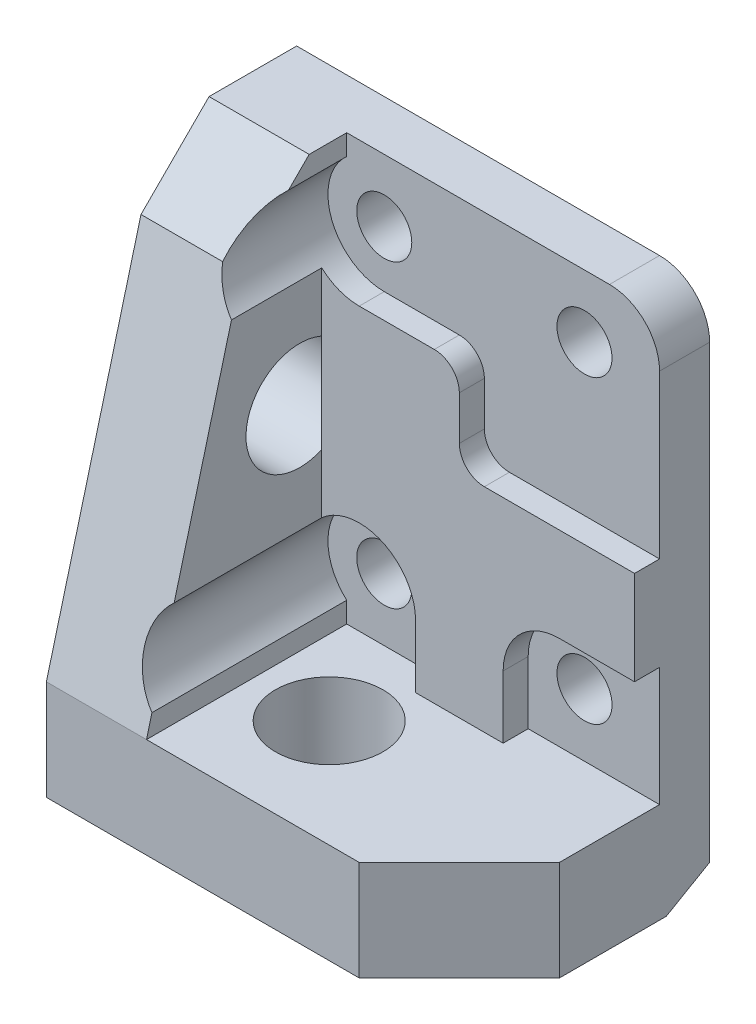
ISO-10303-21;
HEADER;
FILE_DESCRIPTION(('STEP AP214'),'2;1');
FILE_NAME('part.step','',(''),(''),'','','');
FILE_SCHEMA(('AUTOMOTIVE_DESIGN { 1 0 10303 214 1 1 1 1 }'));
ENDSEC;
DATA;
#1=APPLICATION_CONTEXT('core data for automotive mechanical design processes');
#2=APPLICATION_PROTOCOL_DEFINITION('international standard','automotive_design',2000,#1);
#3=PRODUCT_CONTEXT('',#1,'mechanical');
#4=PRODUCT('Part','Part','',(#3));
#5=PRODUCT_RELATED_PRODUCT_CATEGORY('part','',(#4));
#6=PRODUCT_DEFINITION_FORMATION('','',#4);
#7=PRODUCT_DEFINITION_CONTEXT('part definition',#1,'design');
#8=PRODUCT_DEFINITION('design','',#6,#7);
#9=PRODUCT_DEFINITION_SHAPE('','',#8);
#10=(LENGTH_UNIT() NAMED_UNIT(*) SI_UNIT(.MILLI.,.METRE.));
#11=(NAMED_UNIT(*) PLANE_ANGLE_UNIT() SI_UNIT($,.RADIAN.));
#12=(NAMED_UNIT(*) SI_UNIT($,.STERADIAN.) SOLID_ANGLE_UNIT());
#13=UNCERTAINTY_MEASURE_WITH_UNIT(LENGTH_MEASURE(1.E-05),#10,'distance_accuracy_value','');
#14=(GEOMETRIC_REPRESENTATION_CONTEXT(3) GLOBAL_UNCERTAINTY_ASSIGNED_CONTEXT((#13)) GLOBAL_UNIT_ASSIGNED_CONTEXT((#10,
#11,#12)) REPRESENTATION_CONTEXT('',''));
#15=CARTESIAN_POINT('',(0.,0.,0.));
#16=DIRECTION('',(0.,0.,1.));
#17=DIRECTION('',(1.,0.,0.));
#18=AXIS2_PLACEMENT_3D('',#15,#16,#17);
#19=CARTESIAN_POINT('',(-7.5,14.5,3.));
#20=DIRECTION('',(0.,-1.,0.));
#21=DIRECTION('',(1.,0.,0.));
#22=AXIS2_PLACEMENT_3D('',#19,#20,#21);
#23=PLANE('',#22);
#24=DIRECTION('',(0.,0.,-1.));
#25=VECTOR('',#24,1.);
#26=CARTESIAN_POINT('',(-5.5,14.5,5.5));
#27=LINE('',#26,#25);
#28=CARTESIAN_POINT('',(-5.5,14.5,3.49999999999999));
#29=VERTEX_POINT('',#28);
#30=CARTESIAN_POINT('',(-5.5,14.5,0.));
#31=VERTEX_POINT('',#30);
#32=EDGE_CURVE('E392',#29,#31,#27,.T.);
#33=ORIENTED_EDGE('',*,*,#32,.F.);
#34=DIRECTION('',(1.,0.,0.));
#35=VECTOR('',#34,1.);
#36=CARTESIAN_POINT('',(-1.5,14.5,3.49999999999999));
#37=LINE('',#36,#35);
#38=CARTESIAN_POINT('',(-1.5,14.5,3.49999999999999));
#39=VERTEX_POINT('',#38);
#40=EDGE_CURVE('E62',#29,#39,#37,.T.);
#41=ORIENTED_EDGE('',*,*,#40,.T.);
#42=DIRECTION('',(0.,0.,-1.));
#43=VECTOR('',#42,1.);
#44=CARTESIAN_POINT('',(-1.5,14.5,0.));
#45=LINE('',#44,#43);
#46=CARTESIAN_POINT('',(-1.5,14.5,2.));
#47=VERTEX_POINT('',#46);
#48=EDGE_CURVE('E292',#39,#47,#45,.T.);
#49=ORIENTED_EDGE('',*,*,#48,.T.);
#50=DIRECTION('',(1.,0.,0.));
#51=VECTOR('',#50,1.);
#52=CARTESIAN_POINT('',(5.75,14.5,2.));
#53=LINE('',#52,#51);
#54=CARTESIAN_POINT('',(9.,14.5,2.));
#55=VERTEX_POINT('',#54);
#56=EDGE_CURVE('E461',#47,#55,#53,.T.);
#57=ORIENTED_EDGE('',*,*,#56,.T.);
#58=DIRECTION('',(0.,0.,1.));
#59=VECTOR('',#58,1.);
#60=CARTESIAN_POINT('',(9.,14.5,3.));
#61=LINE('',#60,#59);
#62=CARTESIAN_POINT('',(9.,14.5,0.));
#63=VERTEX_POINT('',#62);
#64=EDGE_CURVE('E362',#55,#63,#61,.F.);
#65=ORIENTED_EDGE('',*,*,#64,.T.);
#66=DIRECTION('',(-1.,0.,0.));
#67=VECTOR('',#66,1.);
#68=CARTESIAN_POINT('',(-7.5,14.5,0.));
#69=LINE('',#68,#67);
#70=EDGE_CURVE('E313',#63,#31,#69,.T.);
#71=ORIENTED_EDGE('',*,*,#70,.T.);
#72=EDGE_LOOP('',(#33,#41,#49,#57,#65,#71));
#73=FACE_BOUND('',#72,.T.);
#74=ADVANCED_FACE('F39',(#73),#23,.F.);
#75=CARTESIAN_POINT('',(0.,0.,3.));
#76=DIRECTION('',(0.,0.,1.));
#77=DIRECTION('',(1.,0.,0.));
#78=AXIS2_PLACEMENT_3D('',#75,#76,#77);
#79=PLANE('',#78);
#80=DIRECTION('',(0.,-1.,0.));
#81=VECTOR('',#80,1.);
#82=CARTESIAN_POINT('',(4.,9.75,3.));
#83=LINE('',#82,#81);
#84=CARTESIAN_POINT('',(4.,8.75,3.));
#85=VERTEX_POINT('',#84);
#86=CARTESIAN_POINT('',(4.,7.,3.));
#87=VERTEX_POINT('',#86);
#88=EDGE_CURVE('E237',#85,#87,#83,.T.);
#89=ORIENTED_EDGE('',*,*,#88,.F.);
#90=CARTESIAN_POINT('',(3.,8.75,3.));
#91=DIRECTION('',(0.,0.,1.));
#92=DIRECTION('',(1.,0.,0.));
#93=AXIS2_PLACEMENT_3D('',#90,#91,#92);
#94=CIRCLE('',#93,1.);
#95=CARTESIAN_POINT('',(3.,9.75,3.));
#96=VERTEX_POINT('',#95);
#97=EDGE_CURVE('E374',#85,#96,#94,.T.);
#98=ORIENTED_EDGE('',*,*,#97,.T.);
#99=DIRECTION('',(1.,0.,0.));
#100=VECTOR('',#99,1.);
#101=CARTESIAN_POINT('',(0.,9.75,3.));
#102=LINE('',#101,#100);
#103=CARTESIAN_POINT('',(0.,9.75,3.));
#104=VERTEX_POINT('',#103);
#105=EDGE_CURVE('E422',#104,#96,#102,.T.);
#106=ORIENTED_EDGE('',*,*,#105,.F.);
#107=CARTESIAN_POINT('',(0.,12.,3.));
#108=DIRECTION('',(0.,0.,1.));
#109=DIRECTION('',(1.,0.,0.));
#110=AXIS2_PLACEMENT_3D('',#107,#108,#109);
#111=CIRCLE('',#110,2.25);
#112=CARTESIAN_POINT('',(-1.5,10.3229490168752,3.));
#113=VERTEX_POINT('',#112);
#114=EDGE_CURVE('E275',#104,#113,#111,.F.);
#115=ORIENTED_EDGE('',*,*,#114,.T.);
#116=DIRECTION('',(0.,-1.,0.));
#117=VECTOR('',#116,1.);
#118=CARTESIAN_POINT('',(-1.5,0.,3.));
#119=LINE('',#118,#117);
#120=CARTESIAN_POINT('',(-1.5,7.96389281784928,3.));
#121=VERTEX_POINT('',#120);
#122=EDGE_CURVE('E300',#113,#121,#119,.T.);
#123=ORIENTED_EDGE('',*,*,#122,.T.);
#124=CARTESIAN_POINT('',(-1.5,4.03610718215072,3.));
#125=VERTEX_POINT('',#124);
#126=EDGE_CURVE('E299',#121,#125,#119,.T.);
#127=ORIENTED_EDGE('',*,*,#126,.T.);
#128=CARTESIAN_POINT('',(-1.5,1.67705098312484,3.));
#129=VERTEX_POINT('',#128);
#130=EDGE_CURVE('E297',#125,#129,#119,.T.);
#131=ORIENTED_EDGE('',*,*,#130,.T.);
#132=CARTESIAN_POINT('',(0.,0.,3.));
#133=DIRECTION('',(0.,0.,1.));
#134=DIRECTION('',(1.,0.,0.));
#135=AXIS2_PLACEMENT_3D('',#132,#133,#134);
#136=CIRCLE('',#135,2.25);
#137=CARTESIAN_POINT('',(2.25,0.,3.));
#138=VERTEX_POINT('',#137);
#139=EDGE_CURVE('E280',#129,#138,#136,.F.);
#140=ORIENTED_EDGE('',*,*,#139,.T.);
#141=DIRECTION('',(0.,1.,0.));
#142=VECTOR('',#141,1.);
#143=CARTESIAN_POINT('',(2.25,0.,3.));
#144=LINE('',#143,#142);
#145=CARTESIAN_POINT('',(2.25,-2.5,3.));
#146=VERTEX_POINT('',#145);
#147=EDGE_CURVE('E464',#146,#138,#144,.T.);
#148=ORIENTED_EDGE('',*,*,#147,.F.);
#149=DIRECTION('',(1.,0.,0.));
#150=VECTOR('',#149,1.);
#151=CARTESIAN_POINT('',(-7.5,-2.5,3.));
#152=LINE('',#151,#150);
#153=CARTESIAN_POINT('',(5.75,-2.5,3.));
#154=VERTEX_POINT('',#153);
#155=EDGE_CURVE('E314',#146,#154,#152,.T.);
#156=ORIENTED_EDGE('',*,*,#155,.T.);
#157=DIRECTION('',(0.,-1.,0.));
#158=VECTOR('',#157,1.);
#159=CARTESIAN_POINT('',(5.75,0.,3.));
#160=LINE('',#159,#158);
#161=CARTESIAN_POINT('',(5.75,0.,3.));
#162=VERTEX_POINT('',#161);
#163=EDGE_CURVE('E453',#162,#154,#160,.T.);
#164=ORIENTED_EDGE('',*,*,#163,.F.);
#165=CARTESIAN_POINT('',(8.,0.,3.));
#166=DIRECTION('',(0.,0.,1.));
#167=DIRECTION('',(1.,0.,0.));
#168=AXIS2_PLACEMENT_3D('',#165,#166,#167);
#169=CIRCLE('',#168,2.25);
#170=CARTESIAN_POINT('',(8.,2.25,3.));
#171=VERTEX_POINT('',#170);
#172=EDGE_CURVE('E288',#162,#171,#169,.F.);
#173=ORIENTED_EDGE('',*,*,#172,.T.);
#174=DIRECTION('',(-1.,0.,0.));
#175=VECTOR('',#174,1.);
#176=CARTESIAN_POINT('',(11.,2.25,3.));
#177=LINE('',#176,#175);
#178=CARTESIAN_POINT('',(11.,2.25,3.));
#179=VERTEX_POINT('',#178);
#180=EDGE_CURVE('E255',#179,#171,#177,.T.);
#181=ORIENTED_EDGE('',*,*,#180,.F.);
#182=DIRECTION('',(0.,-1.,0.));
#183=VECTOR('',#182,1.);
#184=CARTESIAN_POINT('',(11.,14.5,3.));
#185=LINE('',#184,#183);
#186=CARTESIAN_POINT('',(11.,6.,3.));
#187=VERTEX_POINT('',#186);
#188=EDGE_CURVE('E243',#187,#179,#185,.T.);
#189=ORIENTED_EDGE('',*,*,#188,.F.);
#190=DIRECTION('',(1.,0.,0.));
#191=VECTOR('',#190,1.);
#192=CARTESIAN_POINT('',(4.,6.,3.));
#193=LINE('',#192,#191);
#194=CARTESIAN_POINT('',(5.,6.,3.));
#195=VERTEX_POINT('',#194);
#196=EDGE_CURVE('E227',#195,#187,#193,.T.);
#197=ORIENTED_EDGE('',*,*,#196,.F.);
#198=CARTESIAN_POINT('',(5.,7.,3.));
#199=DIRECTION('',(0.,0.,1.));
#200=DIRECTION('',(1.,0.,0.));
#201=AXIS2_PLACEMENT_3D('',#198,#199,#200);
#202=CIRCLE('',#201,1.);
#203=EDGE_CURVE('E381',#195,#87,#202,.F.);
#204=ORIENTED_EDGE('',*,*,#203,.T.);
#205=EDGE_LOOP('',(#89,#98,#106,#115,#123,#127,#131,#140,#148,#156,#164,#173,#181,#189,#197,#204));
#206=FACE_BOUND('',#205,.T.);
#207=ADVANCED_FACE('F253',(#206),#79,.T.);
#208=CARTESIAN_POINT('',(0.,12.,10.));
#209=DIRECTION('',(0.,0.,-1.));
#210=DIRECTION('',(-1.,0.,0.));
#211=AXIS2_PLACEMENT_3D('',#208,#209,#210);
#212=CYLINDRICAL_SURFACE('',#211,2.25);
#213=DIRECTION('',(0.,0.,-1.));
#214=VECTOR('',#213,1.);
#215=CARTESIAN_POINT('',(-1.5,13.6770509831248,10.));
#216=LINE('',#215,#214);
#217=CARTESIAN_POINT('',(-1.5,13.6770509831248,2.));
#218=VERTEX_POINT('',#217);
#219=CARTESIAN_POINT('',(-1.5,13.6770509831248,4.32294901687515));
#220=VERTEX_POINT('',#219);
#221=EDGE_CURVE('E322',#218,#220,#216,.F.);
#222=ORIENTED_EDGE('',*,*,#221,.T.);
#223=CARTESIAN_POINT('',(0.,12.,6.));
#224=DIRECTION('',(0.,0.707106781186549,0.707106781186546));
#225=DIRECTION('',(0.,0.707106781186546,-0.707106781186549));
#226=AXIS2_PLACEMENT_3D('',#223,#224,#225);
#227=ELLIPSE('',#226,3.18198051533947,2.25);
#228=CARTESIAN_POINT('',(-2.23921861371328,11.78,6.22));
#229=VERTEX_POINT('',#228);
#230=EDGE_CURVE('E11',#220,#229,#227,.T.);
#231=ORIENTED_EDGE('',*,*,#230,.T.);
#232=CARTESIAN_POINT('',(0.,12.,6.16176470588235));
#233=DIRECTION('',(0.,0.255892560316283,0.966705227861512));
#234=DIRECTION('',(0.,0.966705227861512,-0.255892560316283));
#235=AXIS2_PLACEMENT_3D('',#232,#233,#234);
#236=ELLIPSE('',#235,2.32749336111207,2.25);
#237=CARTESIAN_POINT('',(-1.5,10.3229490168752,6.60568996612128));
#238=VERTEX_POINT('',#237);
#239=EDGE_CURVE('E272',#238,#229,#236,.F.);
#240=ORIENTED_EDGE('',*,*,#239,.F.);
#241=DIRECTION('',(0.,0.,-1.));
#242=VECTOR('',#241,1.);
#243=CARTESIAN_POINT('',(-1.5,10.3229490168752,10.));
#244=LINE('',#243,#242);
#245=EDGE_CURVE('E317',#238,#113,#244,.T.);
#246=ORIENTED_EDGE('',*,*,#245,.T.);
#247=ORIENTED_EDGE('',*,*,#114,.F.);
#248=DIRECTION('',(0.,0.,-1.));
#249=VECTOR('',#248,1.);
#250=CARTESIAN_POINT('',(0.,9.75,10.001));
#251=LINE('',#250,#249);
#252=CARTESIAN_POINT('',(0.,9.75,2.));
#253=VERTEX_POINT('',#252);
#254=EDGE_CURVE('E248',#104,#253,#251,.T.);
#255=ORIENTED_EDGE('',*,*,#254,.T.);
#256=CARTESIAN_POINT('',(0.,12.,2.));
#257=DIRECTION('',(0.,0.,1.));
#258=DIRECTION('',(1.,0.,0.));
#259=AXIS2_PLACEMENT_3D('',#256,#257,#258);
#260=CIRCLE('',#259,2.25);
#261=EDGE_CURVE('E269',#218,#253,#260,.T.);
#262=ORIENTED_EDGE('',*,*,#261,.F.);
#263=EDGE_LOOP('',(#222,#231,#240,#246,#247,#255,#262));
#264=FACE_BOUND('',#263,.T.);
#265=ADVANCED_FACE('F403',(#264),#212,.F.);
#266=CARTESIAN_POINT('',(11.,14.5,-0.00100000000000013));
#267=DIRECTION('',(-1.,0.,0.));
#268=DIRECTION('',(0.,-1.,0.));
#269=AXIS2_PLACEMENT_3D('',#266,#267,#268);
#270=PLANE('',#269);
#271=DIRECTION('',(0.,-1.,0.));
#272=VECTOR('',#271,1.);
#273=CARTESIAN_POINT('',(11.,14.5,2.));
#274=LINE('',#273,#272);
#275=CARTESIAN_POINT('',(11.,12.5,2.));
#276=VERTEX_POINT('',#275);
#277=CARTESIAN_POINT('',(11.,6.,2.));
#278=VERTEX_POINT('',#277);
#279=EDGE_CURVE('E247',#276,#278,#274,.T.);
#280=ORIENTED_EDGE('',*,*,#279,.T.);
#281=DIRECTION('',(0.,0.,-1.));
#282=VECTOR('',#281,1.);
#283=CARTESIAN_POINT('',(11.,6.,10.001));
#284=LINE('',#283,#282);
#285=EDGE_CURVE('E231',#187,#278,#284,.T.);
#286=ORIENTED_EDGE('',*,*,#285,.F.);
#287=ORIENTED_EDGE('',*,*,#188,.T.);
#288=DIRECTION('',(0.,0.,1.));
#289=VECTOR('',#288,1.);
#290=CARTESIAN_POINT('',(11.,2.25,-5.07990112925315));
#291=LINE('',#290,#289);
#292=CARTESIAN_POINT('',(11.,2.25,2.));
#293=VERTEX_POINT('',#292);
#294=EDGE_CURVE('E446',#293,#179,#291,.T.);
#295=ORIENTED_EDGE('',*,*,#294,.F.);
#296=DIRECTION('',(0.,-1.,0.));
#297=VECTOR('',#296,1.);
#298=CARTESIAN_POINT('',(11.,-2.5,2.));
#299=LINE('',#298,#297);
#300=CARTESIAN_POINT('',(11.,-2.5,2.));
#301=VERTEX_POINT('',#300);
#302=EDGE_CURVE('E457',#293,#301,#299,.T.);
#303=ORIENTED_EDGE('',*,*,#302,.T.);
#304=DIRECTION('',(0.,0.,1.));
#305=VECTOR('',#304,1.);
#306=CARTESIAN_POINT('',(11.,-2.5,10.));
#307=LINE('',#306,#305);
#308=CARTESIAN_POINT('',(11.,-2.5,5.99999999999999));
#309=VERTEX_POINT('',#308);
#310=EDGE_CURVE('E488',#301,#309,#307,.T.);
#311=ORIENTED_EDGE('',*,*,#310,.T.);
#312=DIRECTION('',(0.,-1.,0.));
#313=VECTOR('',#312,1.);
#314=CARTESIAN_POINT('',(11.,14.5,5.99999999999999));
#315=LINE('',#314,#313);
#316=CARTESIAN_POINT('',(11.,-6.5,5.99999999999999));
#317=VERTEX_POINT('',#316);
#318=EDGE_CURVE('E354',#309,#317,#315,.T.);
#319=ORIENTED_EDGE('',*,*,#318,.T.);
#320=DIRECTION('',(0.,0.,1.));
#321=VECTOR('',#320,1.);
#322=CARTESIAN_POINT('',(11.,-6.5,10.));
#323=LINE('',#322,#321);
#324=CARTESIAN_POINT('',(11.,-6.5,1.73205080756888));
#325=VERTEX_POINT('',#324);
#326=EDGE_CURVE('E492',#325,#317,#323,.T.);
#327=ORIENTED_EDGE('',*,*,#326,.F.);
#328=DIRECTION('',(0.,0.500000000000001,-0.866025403784438));
#329=VECTOR('',#328,1.);
#330=CARTESIAN_POINT('',(11.,-6.5,1.73205080756887));
#331=LINE('',#330,#329);
#332=CARTESIAN_POINT('',(11.,-5.5,0.));
#333=VERTEX_POINT('',#332);
#334=EDGE_CURVE('E343',#325,#333,#331,.T.);
#335=ORIENTED_EDGE('',*,*,#334,.T.);
#336=DIRECTION('',(0.,1.,0.));
#337=VECTOR('',#336,1.);
#338=CARTESIAN_POINT('',(11.,14.5,0.));
#339=LINE('',#338,#337);
#340=CARTESIAN_POINT('',(11.,12.5,0.));
#341=VERTEX_POINT('',#340);
#342=EDGE_CURVE('E257',#333,#341,#339,.T.);
#343=ORIENTED_EDGE('',*,*,#342,.T.);
#344=DIRECTION('',(0.,0.,1.));
#345=VECTOR('',#344,1.);
#346=CARTESIAN_POINT('',(11.,12.5,-0.00100000000000013));
#347=LINE('',#346,#345);
#348=EDGE_CURVE('E358',#341,#276,#347,.T.);
#349=ORIENTED_EDGE('',*,*,#348,.T.);
#350=EDGE_LOOP('',(#280,#286,#287,#295,#303,#311,#319,#327,#335,#343,#349));
#351=FACE_BOUND('',#350,.T.);
#352=ADVANCED_FACE('F241',(#351),#270,.F.);
#353=CARTESIAN_POINT('',(0.,0.,0.));
#354=DIRECTION('',(0.,0.,1.));
#355=DIRECTION('',(1.,0.,0.));
#356=AXIS2_PLACEMENT_3D('',#353,#354,#355);
#357=PLANE('',#356);
#358=CARTESIAN_POINT('',(0.,0.,0.));
#359=DIRECTION('',(0.,0.,1.));
#360=DIRECTION('',(1.,0.,0.));
#361=AXIS2_PLACEMENT_3D('',#358,#359,#360);
#362=CIRCLE('',#361,1.1);
#363=CARTESIAN_POINT('',(1.1,0.,0.));
#364=VERTEX_POINT('',#363);
#365=EDGE_CURVE('E310',#364,#364,#362,.T.);
#366=ORIENTED_EDGE('',*,*,#365,.T.);
#367=EDGE_LOOP('',(#366));
#368=FACE_BOUND('',#367,.T.);
#369=CARTESIAN_POINT('',(8.,0.,0.));
#370=DIRECTION('',(0.,0.,1.));
#371=DIRECTION('',(1.,0.,0.));
#372=AXIS2_PLACEMENT_3D('',#369,#370,#371);
#373=CIRCLE('',#372,1.1);
#374=CARTESIAN_POINT('',(9.1,0.,0.));
#375=VERTEX_POINT('',#374);
#376=EDGE_CURVE('E307',#375,#375,#373,.T.);
#377=ORIENTED_EDGE('',*,*,#376,.T.);
#378=EDGE_LOOP('',(#377));
#379=FACE_BOUND('',#378,.T.);
#380=CARTESIAN_POINT('',(0.,12.,0.));
#381=DIRECTION('',(0.,0.,1.));
#382=DIRECTION('',(1.,0.,0.));
#383=AXIS2_PLACEMENT_3D('',#380,#381,#382);
#384=CIRCLE('',#383,1.1);
#385=CARTESIAN_POINT('',(1.1,12.,0.));
#386=VERTEX_POINT('',#385);
#387=EDGE_CURVE('E304',#386,#386,#384,.T.);
#388=ORIENTED_EDGE('',*,*,#387,.T.);
#389=EDGE_LOOP('',(#388));
#390=FACE_BOUND('',#389,.T.);
#391=CARTESIAN_POINT('',(8.,12.,0.));
#392=DIRECTION('',(0.,0.,1.));
#393=DIRECTION('',(1.,0.,0.));
#394=AXIS2_PLACEMENT_3D('',#391,#392,#393);
#395=CIRCLE('',#394,1.1);
#396=CARTESIAN_POINT('',(9.1,12.,0.));
#397=VERTEX_POINT('',#396);
#398=EDGE_CURVE('E301',#397,#397,#395,.T.);
#399=ORIENTED_EDGE('',*,*,#398,.T.);
#400=EDGE_LOOP('',(#399));
#401=FACE_BOUND('',#400,.T.);
#402=ORIENTED_EDGE('',*,*,#70,.F.);
#403=CARTESIAN_POINT('',(9.,12.5,0.));
#404=DIRECTION('',(0.,0.,1.));
#405=DIRECTION('',(1.,0.,0.));
#406=AXIS2_PLACEMENT_3D('',#403,#404,#405);
#407=CIRCLE('',#406,2.);
#408=EDGE_CURVE('E364',#63,#341,#407,.F.);
#409=ORIENTED_EDGE('',*,*,#408,.T.);
#410=ORIENTED_EDGE('',*,*,#342,.F.);
#411=DIRECTION('',(-1.,0.,0.));
#412=VECTOR('',#411,1.);
#413=CARTESIAN_POINT('',(-5.5,-5.5,0.));
#414=LINE('',#413,#412);
#415=CARTESIAN_POINT('',(-5.5,-5.5,0.));
#416=VERTEX_POINT('',#415);
#417=EDGE_CURVE('E345',#333,#416,#414,.T.);
#418=ORIENTED_EDGE('',*,*,#417,.T.);
#419=DIRECTION('',(0.,-1.,0.));
#420=VECTOR('',#419,1.);
#421=CARTESIAN_POINT('',(-5.5,14.5,0.));
#422=LINE('',#421,#420);
#423=EDGE_CURVE('E398',#31,#416,#422,.T.);
#424=ORIENTED_EDGE('',*,*,#423,.F.);
#425=EDGE_LOOP('',(#402,#409,#410,#418,#424));
#426=FACE_BOUND('',#425,.T.);
#427=ADVANCED_FACE('F569',(#368,#379,#390,#401,#426),#357,.F.);
#428=CARTESIAN_POINT('',(-1.5,14.5,5.5));
#429=DIRECTION('',(0.,0.255892560316283,0.966705227861512));
#430=DIRECTION('',(0.,-0.966705227861512,0.255892560316283));
#431=AXIS2_PLACEMENT_3D('',#428,#429,#430);
#432=PLANE('',#431);
#433=ORIENTED_EDGE('',*,*,#239,.T.);
#434=DIRECTION('',(-1.,0.,0.));
#435=VECTOR('',#434,1.);
#436=CARTESIAN_POINT('',(-5.5,11.78,6.22));
#437=LINE('',#436,#435);
#438=CARTESIAN_POINT('',(-5.5,11.78,6.22));
#439=VERTEX_POINT('',#438);
#440=EDGE_CURVE('E383',#229,#439,#437,.T.);
#441=ORIENTED_EDGE('',*,*,#440,.T.);
#442=DIRECTION('',(0.,0.966705227861512,-0.255892560316283));
#443=VECTOR('',#442,1.);
#444=CARTESIAN_POINT('',(-5.5,-2.5,10.));
#445=LINE('',#444,#443);
#446=CARTESIAN_POINT('',(-5.5,-2.5,10.));
#447=VERTEX_POINT('',#446);
#448=EDGE_CURVE('E263',#447,#439,#445,.T.);
#449=ORIENTED_EDGE('',*,*,#448,.F.);
#450=DIRECTION('',(-1.,0.,0.));
#451=VECTOR('',#450,1.);
#452=CARTESIAN_POINT('',(-1.5,-2.5,10.));
#453=LINE('',#452,#451);
#454=CARTESIAN_POINT('',(-1.5,-2.5,10.));
#455=VERTEX_POINT('',#454);
#456=EDGE_CURVE('E294',#455,#447,#453,.T.);
#457=ORIENTED_EDGE('',*,*,#456,.F.);
#458=DIRECTION('',(0.,0.966705227861512,-0.255892560316283));
#459=VECTOR('',#458,1.);
#460=CARTESIAN_POINT('',(-1.5,14.5,5.5));
#461=LINE('',#460,#459);
#462=CARTESIAN_POINT('',(-1.5,-1.67705098312485,9.78216055435658));
#463=VERTEX_POINT('',#462);
#464=EDGE_CURVE('E289',#455,#463,#461,.T.);
#465=ORIENTED_EDGE('',*,*,#464,.T.);
#466=CARTESIAN_POINT('',(0.,0.,9.33823529411765));
#467=DIRECTION('',(0.,0.255892560316283,0.966705227861512));
#468=DIRECTION('',(0.,0.966705227861512,-0.255892560316283));
#469=AXIS2_PLACEMENT_3D('',#466,#467,#468);
#470=ELLIPSE('',#469,2.32749336111207,2.25);
#471=CARTESIAN_POINT('',(-1.5,1.67705098312484,8.89431003387872));
#472=VERTEX_POINT('',#471);
#473=EDGE_CURVE('E277',#463,#472,#470,.F.);
#474=ORIENTED_EDGE('',*,*,#473,.T.);
#475=EDGE_CURVE('E287',#472,#238,#461,.T.);
#476=ORIENTED_EDGE('',*,*,#475,.T.);
#477=EDGE_LOOP('',(#433,#441,#449,#457,#465,#474,#476));
#478=FACE_BOUND('',#477,.T.);
#479=ADVANCED_FACE('F408',(#478),#432,.T.);
#480=CARTESIAN_POINT('',(0.,0.,3.));
#481=DIRECTION('',(0.,0.,-1.));
#482=DIRECTION('',(-1.,0.,0.));
#483=AXIS2_PLACEMENT_3D('',#480,#481,#482);
#484=CYLINDRICAL_SURFACE('',#483,1.1);
#485=ORIENTED_EDGE('',*,*,#365,.F.);
#486=EDGE_LOOP('',(#485));
#487=FACE_BOUND('',#486,.T.);
#488=CARTESIAN_POINT('',(0.,0.,2.));
#489=DIRECTION('',(0.,0.,1.));
#490=DIRECTION('',(1.,0.,0.));
#491=AXIS2_PLACEMENT_3D('',#488,#489,#490);
#492=CIRCLE('',#491,1.1);
#493=CARTESIAN_POINT('',(1.1,0.,2.));
#494=VERTEX_POINT('',#493);
#495=EDGE_CURVE('E337',#494,#494,#492,.T.);
#496=ORIENTED_EDGE('',*,*,#495,.T.);
#497=EDGE_LOOP('',(#496));
#498=FACE_BOUND('',#497,.T.);
#499=ADVANCED_FACE('F617',(#487,#498),#484,.F.);
#500=CARTESIAN_POINT('',(8.,0.,3.));
#501=DIRECTION('',(0.,0.,-1.));
#502=DIRECTION('',(-1.,0.,0.));
#503=AXIS2_PLACEMENT_3D('',#500,#501,#502);
#504=CYLINDRICAL_SURFACE('',#503,1.1);
#505=ORIENTED_EDGE('',*,*,#376,.F.);
#506=EDGE_LOOP('',(#505));
#507=FACE_BOUND('',#506,.T.);
#508=CARTESIAN_POINT('',(8.,0.,2.));
#509=DIRECTION('',(0.,0.,1.));
#510=DIRECTION('',(1.,0.,0.));
#511=AXIS2_PLACEMENT_3D('',#508,#509,#510);
#512=CIRCLE('',#511,1.1);
#513=CARTESIAN_POINT('',(9.1,0.,2.));
#514=VERTEX_POINT('',#513);
#515=EDGE_CURVE('E334',#514,#514,#512,.T.);
#516=ORIENTED_EDGE('',*,*,#515,.T.);
#517=EDGE_LOOP('',(#516));
#518=FACE_BOUND('',#517,.T.);
#519=ADVANCED_FACE('F642',(#507,#518),#504,.F.);
#520=CARTESIAN_POINT('',(0.,12.,3.));
#521=DIRECTION('',(0.,0.,-1.));
#522=DIRECTION('',(-1.,0.,0.));
#523=AXIS2_PLACEMENT_3D('',#520,#521,#522);
#524=CYLINDRICAL_SURFACE('',#523,1.1);
#525=ORIENTED_EDGE('',*,*,#387,.F.);
#526=EDGE_LOOP('',(#525));
#527=FACE_BOUND('',#526,.T.);
#528=CARTESIAN_POINT('',(0.,12.,2.));
#529=DIRECTION('',(0.,0.,1.));
#530=DIRECTION('',(1.,0.,0.));
#531=AXIS2_PLACEMENT_3D('',#528,#529,#530);
#532=CIRCLE('',#531,1.1);
#533=CARTESIAN_POINT('',(1.1,12.,2.));
#534=VERTEX_POINT('',#533);
#535=EDGE_CURVE('E331',#534,#534,#532,.T.);
#536=ORIENTED_EDGE('',*,*,#535,.T.);
#537=EDGE_LOOP('',(#536));
#538=FACE_BOUND('',#537,.T.);
#539=ADVANCED_FACE('F631',(#527,#538),#524,.F.);
#540=CARTESIAN_POINT('',(8.,12.,3.));
#541=DIRECTION('',(0.,0.,-1.));
#542=DIRECTION('',(-1.,0.,0.));
#543=AXIS2_PLACEMENT_3D('',#540,#541,#542);
#544=CYLINDRICAL_SURFACE('',#543,1.1);
#545=ORIENTED_EDGE('',*,*,#398,.F.);
#546=EDGE_LOOP('',(#545));
#547=FACE_BOUND('',#546,.T.);
#548=CARTESIAN_POINT('',(8.,12.,2.));
#549=DIRECTION('',(0.,0.,1.));
#550=DIRECTION('',(1.,0.,0.));
#551=AXIS2_PLACEMENT_3D('',#548,#549,#550);
#552=CIRCLE('',#551,1.1);
#553=CARTESIAN_POINT('',(9.1,12.,2.));
#554=VERTEX_POINT('',#553);
#555=EDGE_CURVE('E283',#554,#554,#552,.T.);
#556=ORIENTED_EDGE('',*,*,#555,.T.);
#557=EDGE_LOOP('',(#556));
#558=FACE_BOUND('',#557,.T.);
#559=ADVANCED_FACE('F628',(#547,#558),#544,.F.);
#560=CARTESIAN_POINT('',(-1.5,0.,0.));
#561=DIRECTION('',(-1.,0.,0.));
#562=DIRECTION('',(0.,-1.,0.));
#563=AXIS2_PLACEMENT_3D('',#560,#561,#562);
#564=PLANE('',#563);
#565=ORIENTED_EDGE('',*,*,#130,.F.);
#566=CARTESIAN_POINT('',(-1.5,6.,3.875));
#567=DIRECTION('',(-1.,0.,0.));
#568=DIRECTION('',(0.,-1.,0.));
#569=AXIS2_PLACEMENT_3D('',#566,#567,#568);
#570=CIRCLE('',#569,2.15);
#571=EDGE_CURVE('E505',#125,#121,#570,.T.);
#572=ORIENTED_EDGE('',*,*,#571,.T.);
#573=ORIENTED_EDGE('',*,*,#122,.F.);
#574=ORIENTED_EDGE('',*,*,#245,.F.);
#575=ORIENTED_EDGE('',*,*,#475,.F.);
#576=DIRECTION('',(0.,0.,-1.));
#577=VECTOR('',#576,1.);
#578=CARTESIAN_POINT('',(-1.5,1.67705098312484,10.));
#579=LINE('',#578,#577);
#580=EDGE_CURVE('E326',#129,#472,#579,.F.);
#581=ORIENTED_EDGE('',*,*,#580,.F.);
#582=EDGE_LOOP('',(#565,#572,#573,#574,#575,#581));
#583=FACE_BOUND('',#582,.T.);
#584=ADVANCED_FACE('F413',(#583),#564,.F.);
#585=DIRECTION('',(0.,0.,-1.));
#586=VECTOR('',#585,1.);
#587=CARTESIAN_POINT('',(-1.5,-1.67705098312485,10.));
#588=LINE('',#587,#586);
#589=CARTESIAN_POINT('',(-1.5,-1.67705098312485,2.));
#590=VERTEX_POINT('',#589);
#591=EDGE_CURVE('E324',#463,#590,#588,.T.);
#592=ORIENTED_EDGE('',*,*,#591,.F.);
#593=ORIENTED_EDGE('',*,*,#464,.F.);
#594=DIRECTION('',(0.,0.,1.));
#595=VECTOR('',#594,1.);
#596=CARTESIAN_POINT('',(-1.5,-2.5,0.));
#597=LINE('',#596,#595);
#598=CARTESIAN_POINT('',(-1.5,-2.5,2.));
#599=VERTEX_POINT('',#598);
#600=EDGE_CURVE('E284',#599,#455,#597,.T.);
#601=ORIENTED_EDGE('',*,*,#600,.F.);
#602=DIRECTION('',(0.,1.,0.));
#603=VECTOR('',#602,1.);
#604=CARTESIAN_POINT('',(-1.5,-2.5,2.));
#605=LINE('',#604,#603);
#606=EDGE_CURVE('E455',#599,#590,#605,.T.);
#607=ORIENTED_EDGE('',*,*,#606,.T.);
#608=EDGE_LOOP('',(#592,#593,#601,#607));
#609=FACE_BOUND('',#608,.T.);
#610=ADVANCED_FACE('F538',(#609),#564,.F.);
#611=ORIENTED_EDGE('',*,*,#48,.F.);
#612=DIRECTION('',(0.,-0.707106781186546,0.707106781186549));
#613=VECTOR('',#612,1.);
#614=CARTESIAN_POINT('',(-1.5,11.78,6.22));
#615=LINE('',#614,#613);
#616=EDGE_CURVE('E48',#39,#220,#615,.T.);
#617=ORIENTED_EDGE('',*,*,#616,.T.);
#618=ORIENTED_EDGE('',*,*,#221,.F.);
#619=DIRECTION('',(0.,1.,0.));
#620=VECTOR('',#619,1.);
#621=CARTESIAN_POINT('',(-1.5,13.6770509831248,2.));
#622=LINE('',#621,#620);
#623=EDGE_CURVE('E466',#218,#47,#622,.T.);
#624=ORIENTED_EDGE('',*,*,#623,.T.);
#625=EDGE_LOOP('',(#611,#617,#618,#624));
#626=FACE_BOUND('',#625,.T.);
#627=ADVANCED_FACE('F607',(#626),#564,.F.);
#628=CARTESIAN_POINT('',(0.,0.,10.));
#629=DIRECTION('',(0.,0.,-1.));
#630=DIRECTION('',(-1.,0.,0.));
#631=AXIS2_PLACEMENT_3D('',#628,#629,#630);
#632=CYLINDRICAL_SURFACE('',#631,2.25);
#633=DIRECTION('',(0.,0.,1.));
#634=VECTOR('',#633,1.);
#635=CARTESIAN_POINT('',(2.25,0.,-5.07990112925315));
#636=LINE('',#635,#634);
#637=CARTESIAN_POINT('',(2.25,0.,2.));
#638=VERTEX_POINT('',#637);
#639=EDGE_CURVE('E472',#638,#138,#636,.T.);
#640=ORIENTED_EDGE('',*,*,#639,.T.);
#641=ORIENTED_EDGE('',*,*,#139,.F.);
#642=ORIENTED_EDGE('',*,*,#580,.T.);
#643=ORIENTED_EDGE('',*,*,#473,.F.);
#644=ORIENTED_EDGE('',*,*,#591,.T.);
#645=CARTESIAN_POINT('',(0.,0.,2.));
#646=DIRECTION('',(0.,0.,1.));
#647=DIRECTION('',(1.,0.,0.));
#648=AXIS2_PLACEMENT_3D('',#645,#646,#647);
#649=CIRCLE('',#648,2.25);
#650=EDGE_CURVE('E260',#638,#590,#649,.T.);
#651=ORIENTED_EDGE('',*,*,#650,.F.);
#652=EDGE_LOOP('',(#640,#641,#642,#643,#644,#651));
#653=FACE_BOUND('',#652,.T.);
#654=ADVANCED_FACE('F541',(#653),#632,.F.);
#655=CARTESIAN_POINT('',(0.,0.,2.));
#656=DIRECTION('',(0.,0.,1.));
#657=DIRECTION('',(1.,0.,0.));
#658=AXIS2_PLACEMENT_3D('',#655,#656,#657);
#659=PLANE('',#658);
#660=ORIENTED_EDGE('',*,*,#495,.F.);
#661=EDGE_LOOP('',(#660));
#662=FACE_BOUND('',#661,.T.);
#663=ORIENTED_EDGE('',*,*,#650,.T.);
#664=ORIENTED_EDGE('',*,*,#606,.F.);
#665=DIRECTION('',(-1.,0.,0.));
#666=VECTOR('',#665,1.);
#667=CARTESIAN_POINT('',(2.25,-2.5,2.));
#668=LINE('',#667,#666);
#669=CARTESIAN_POINT('',(2.25,-2.5,2.));
#670=VERTEX_POINT('',#669);
#671=EDGE_CURVE('E475',#670,#599,#668,.T.);
#672=ORIENTED_EDGE('',*,*,#671,.F.);
#673=DIRECTION('',(0.,-1.,0.));
#674=VECTOR('',#673,1.);
#675=CARTESIAN_POINT('',(2.25,0.,2.));
#676=LINE('',#675,#674);
#677=EDGE_CURVE('E469',#638,#670,#676,.T.);
#678=ORIENTED_EDGE('',*,*,#677,.F.);
#679=EDGE_LOOP('',(#663,#664,#672,#678));
#680=FACE_BOUND('',#679,.T.);
#681=ADVANCED_FACE('F637',(#662,#680),#659,.T.);
#682=CARTESIAN_POINT('',(8.,12.,2.));
#683=DIRECTION('',(0.,0.,1.));
#684=DIRECTION('',(1.,0.,0.));
#685=AXIS2_PLACEMENT_3D('',#682,#683,#684);
#686=PLANE('',#685);
#687=DIRECTION('',(0.,-1.,0.));
#688=VECTOR('',#687,1.);
#689=CARTESIAN_POINT('',(4.,9.75,2.));
#690=LINE('',#689,#688);
#691=CARTESIAN_POINT('',(4.,8.75,2.));
#692=VERTEX_POINT('',#691);
#693=CARTESIAN_POINT('',(4.,7.,2.));
#694=VERTEX_POINT('',#693);
#695=EDGE_CURVE('E429',#692,#694,#690,.T.);
#696=ORIENTED_EDGE('',*,*,#695,.T.);
#697=CARTESIAN_POINT('',(5.,7.,2.));
#698=DIRECTION('',(0.,0.,1.));
#699=DIRECTION('',(1.,0.,0.));
#700=AXIS2_PLACEMENT_3D('',#697,#698,#699);
#701=CIRCLE('',#700,1.);
#702=CARTESIAN_POINT('',(5.,6.,2.));
#703=VERTEX_POINT('',#702);
#704=EDGE_CURVE('E376',#694,#703,#701,.T.);
#705=ORIENTED_EDGE('',*,*,#704,.T.);
#706=DIRECTION('',(1.,0.,0.));
#707=VECTOR('',#706,1.);
#708=CARTESIAN_POINT('',(4.,6.,2.));
#709=LINE('',#708,#707);
#710=EDGE_CURVE('E249',#703,#278,#709,.T.);
#711=ORIENTED_EDGE('',*,*,#710,.T.);
#712=ORIENTED_EDGE('',*,*,#279,.F.);
#713=CARTESIAN_POINT('',(9.,12.5,2.));
#714=DIRECTION('',(0.,0.,1.));
#715=DIRECTION('',(1.,0.,0.));
#716=AXIS2_PLACEMENT_3D('',#713,#714,#715);
#717=CIRCLE('',#716,2.);
#718=EDGE_CURVE('E360',#276,#55,#717,.T.);
#719=ORIENTED_EDGE('',*,*,#718,.T.);
#720=ORIENTED_EDGE('',*,*,#56,.F.);
#721=ORIENTED_EDGE('',*,*,#623,.F.);
#722=ORIENTED_EDGE('',*,*,#261,.T.);
#723=DIRECTION('',(1.,0.,0.));
#724=VECTOR('',#723,1.);
#725=CARTESIAN_POINT('',(0.,9.75,2.));
#726=LINE('',#725,#724);
#727=CARTESIAN_POINT('',(3.,9.75,2.));
#728=VERTEX_POINT('',#727);
#729=EDGE_CURVE('E426',#253,#728,#726,.T.);
#730=ORIENTED_EDGE('',*,*,#729,.T.);
#731=CARTESIAN_POINT('',(3.,8.75,2.));
#732=DIRECTION('',(0.,0.,1.));
#733=DIRECTION('',(1.,0.,0.));
#734=AXIS2_PLACEMENT_3D('',#731,#732,#733);
#735=CIRCLE('',#734,1.);
#736=EDGE_CURVE('E379',#728,#692,#735,.F.);
#737=ORIENTED_EDGE('',*,*,#736,.T.);
#738=EDGE_LOOP('',(#696,#705,#711,#712,#719,#720,#721,#722,#730,#737));
#739=FACE_BOUND('',#738,.T.);
#740=ORIENTED_EDGE('',*,*,#555,.F.);
#741=EDGE_LOOP('',(#740));
#742=FACE_BOUND('',#741,.T.);
#743=ORIENTED_EDGE('',*,*,#535,.F.);
#744=EDGE_LOOP('',(#743));
#745=FACE_BOUND('',#744,.T.);
#746=ADVANCED_FACE('F603',(#739,#742,#745),#686,.T.);
#747=CARTESIAN_POINT('',(8.,0.,10.));
#748=DIRECTION('',(0.,0.,-1.));
#749=DIRECTION('',(-1.,0.,0.));
#750=AXIS2_PLACEMENT_3D('',#747,#748,#749);
#751=CYLINDRICAL_SURFACE('',#750,2.25);
#752=DIRECTION('',(0.,0.,1.));
#753=VECTOR('',#752,1.);
#754=CARTESIAN_POINT('',(8.,2.25,-5.07990112925315));
#755=LINE('',#754,#753);
#756=CARTESIAN_POINT('',(8.,2.25,2.));
#757=VERTEX_POINT('',#756);
#758=EDGE_CURVE('E448',#757,#171,#755,.T.);
#759=ORIENTED_EDGE('',*,*,#758,.T.);
#760=ORIENTED_EDGE('',*,*,#172,.F.);
#761=DIRECTION('',(0.,0.,1.));
#762=VECTOR('',#761,1.);
#763=CARTESIAN_POINT('',(5.75,0.,-5.07990112925315));
#764=LINE('',#763,#762);
#765=CARTESIAN_POINT('',(5.75,0.,2.));
#766=VERTEX_POINT('',#765);
#767=EDGE_CURVE('E441',#766,#162,#764,.T.);
#768=ORIENTED_EDGE('',*,*,#767,.F.);
#769=CARTESIAN_POINT('',(8.,0.,2.));
#770=DIRECTION('',(0.,0.,1.));
#771=DIRECTION('',(1.,0.,0.));
#772=AXIS2_PLACEMENT_3D('',#769,#770,#771);
#773=CIRCLE('',#772,2.25);
#774=EDGE_CURVE('E256',#757,#766,#773,.T.);
#775=ORIENTED_EDGE('',*,*,#774,.F.);
#776=EDGE_LOOP('',(#759,#760,#768,#775));
#777=FACE_BOUND('',#776,.T.);
#778=ADVANCED_FACE('F636',(#777),#751,.F.);
#779=CARTESIAN_POINT('',(8.,0.,2.));
#780=DIRECTION('',(0.,0.,1.));
#781=DIRECTION('',(1.,0.,0.));
#782=AXIS2_PLACEMENT_3D('',#779,#780,#781);
#783=PLANE('',#782);
#784=ORIENTED_EDGE('',*,*,#515,.F.);
#785=EDGE_LOOP('',(#784));
#786=FACE_BOUND('',#785,.T.);
#787=ORIENTED_EDGE('',*,*,#774,.T.);
#788=DIRECTION('',(0.,1.,0.));
#789=VECTOR('',#788,1.);
#790=CARTESIAN_POINT('',(5.75,0.,2.));
#791=LINE('',#790,#789);
#792=CARTESIAN_POINT('',(5.75,-2.5,2.));
#793=VERTEX_POINT('',#792);
#794=EDGE_CURVE('E438',#793,#766,#791,.T.);
#795=ORIENTED_EDGE('',*,*,#794,.F.);
#796=DIRECTION('',(-1.,0.,0.));
#797=VECTOR('',#796,1.);
#798=CARTESIAN_POINT('',(5.75,-2.5,2.));
#799=LINE('',#798,#797);
#800=EDGE_CURVE('E451',#301,#793,#799,.T.);
#801=ORIENTED_EDGE('',*,*,#800,.F.);
#802=ORIENTED_EDGE('',*,*,#302,.F.);
#803=DIRECTION('',(1.,0.,0.));
#804=VECTOR('',#803,1.);
#805=CARTESIAN_POINT('',(11.,2.25,2.));
#806=LINE('',#805,#804);
#807=EDGE_CURVE('E440',#757,#293,#806,.T.);
#808=ORIENTED_EDGE('',*,*,#807,.F.);
#809=EDGE_LOOP('',(#787,#795,#801,#802,#808));
#810=FACE_BOUND('',#809,.T.);
#811=ADVANCED_FACE('F674',(#786,#810),#783,.T.);
#812=CARTESIAN_POINT('',(-5.5,0.,0.));
#813=DIRECTION('',(-1.,0.,0.));
#814=DIRECTION('',(0.,-1.,0.));
#815=AXIS2_PLACEMENT_3D('',#812,#813,#814);
#816=PLANE('',#815);
#817=CARTESIAN_POINT('',(-5.5,6.,3.875));
#818=DIRECTION('',(-1.,0.,0.));
#819=DIRECTION('',(0.,-1.,0.));
#820=AXIS2_PLACEMENT_3D('',#817,#818,#819);
#821=CIRCLE('',#820,2.15);
#822=CARTESIAN_POINT('',(-5.5,3.85,3.875));
#823=VERTEX_POINT('',#822);
#824=EDGE_CURVE('E503',#823,#823,#821,.T.);
#825=ORIENTED_EDGE('',*,*,#824,.F.);
#826=EDGE_LOOP('',(#825));
#827=FACE_BOUND('',#826,.T.);
#828=ORIENTED_EDGE('',*,*,#448,.T.);
#829=DIRECTION('',(0.,0.707106781186546,-0.707106781186549));
#830=VECTOR('',#829,1.);
#831=CARTESIAN_POINT('',(-5.5,9.00000000000002,8.99999999999999));
#832=LINE('',#831,#830);
#833=EDGE_CURVE('E386',#439,#29,#832,.T.);
#834=ORIENTED_EDGE('',*,*,#833,.T.);
#835=ORIENTED_EDGE('',*,*,#32,.T.);
#836=ORIENTED_EDGE('',*,*,#423,.T.);
#837=DIRECTION('',(0.,-0.500000000000001,0.866025403784438));
#838=VECTOR('',#837,1.);
#839=CARTESIAN_POINT('',(-5.5,-4.12499999999999,-2.38156986040721));
#840=LINE('',#839,#838);
#841=CARTESIAN_POINT('',(-5.5,-6.5,1.73205080756888));
#842=VERTEX_POINT('',#841);
#843=EDGE_CURVE('E347',#416,#842,#840,.T.);
#844=ORIENTED_EDGE('',*,*,#843,.T.);
#845=DIRECTION('',(0.,0.,-1.));
#846=VECTOR('',#845,1.);
#847=CARTESIAN_POINT('',(-5.5,-6.5,10.));
#848=LINE('',#847,#846);
#849=CARTESIAN_POINT('',(-5.5,-6.5,10.));
#850=VERTEX_POINT('',#849);
#851=EDGE_CURVE('E489',#850,#842,#848,.T.);
#852=ORIENTED_EDGE('',*,*,#851,.F.);
#853=DIRECTION('',(0.,1.,0.));
#854=VECTOR('',#853,1.);
#855=CARTESIAN_POINT('',(-5.5,-6.5,10.));
#856=LINE('',#855,#854);
#857=EDGE_CURVE('E498',#850,#447,#856,.T.);
#858=ORIENTED_EDGE('',*,*,#857,.T.);
#859=EDGE_LOOP('',(#828,#834,#835,#836,#844,#852,#858));
#860=FACE_BOUND('',#859,.T.);
#861=ADVANCED_FACE('F390',(#827,#860),#816,.T.);
#862=CARTESIAN_POINT('',(-1.5,6.,3.875));
#863=DIRECTION('',(-1.,0.,0.));
#864=DIRECTION('',(0.,-1.,0.));
#865=AXIS2_PLACEMENT_3D('',#862,#863,#864);
#866=CYLINDRICAL_SURFACE('',#865,2.15);
#867=EDGE_CURVE('E399',#121,#125,#570,.T.);
#868=ORIENTED_EDGE('',*,*,#867,.F.);
#869=ORIENTED_EDGE('',*,*,#571,.F.);
#870=EDGE_LOOP('',(#868,#869));
#871=FACE_BOUND('',#870,.T.);
#872=ORIENTED_EDGE('',*,*,#824,.T.);
#873=EDGE_LOOP('',(#872));
#874=FACE_BOUND('',#873,.T.);
#875=ADVANCED_FACE('F549',(#871,#874),#866,.F.);
#876=CARTESIAN_POINT('',(-1.5,6.,3.875));
#877=DIRECTION('',(-1.,0.,0.));
#878=DIRECTION('',(0.,-1.,0.));
#879=AXIS2_PLACEMENT_3D('',#876,#877,#878);
#880=PLANE('',#879);
#881=ORIENTED_EDGE('',*,*,#867,.T.);
#882=ORIENTED_EDGE('',*,*,#126,.F.);
#883=EDGE_LOOP('',(#881,#882));
#884=FACE_BOUND('',#883,.T.);
#885=ADVANCED_FACE('F552',(#884),#880,.T.);
#886=CARTESIAN_POINT('',(-5.5,-6.5,10.));
#887=DIRECTION('',(0.,0.,-1.));
#888=DIRECTION('',(-1.,0.,0.));
#889=AXIS2_PLACEMENT_3D('',#886,#887,#888);
#890=PLANE('',#889);
#891=DIRECTION('',(-1.,0.,0.));
#892=VECTOR('',#891,1.);
#893=CARTESIAN_POINT('',(-5.5,-6.5,10.));
#894=LINE('',#893,#892);
#895=CARTESIAN_POINT('',(7.,-6.5,10.));
#896=VERTEX_POINT('',#895);
#897=EDGE_CURVE('E496',#896,#850,#894,.T.);
#898=ORIENTED_EDGE('',*,*,#897,.F.);
#899=DIRECTION('',(0.,1.,0.));
#900=VECTOR('',#899,1.);
#901=CARTESIAN_POINT('',(7.,-6.5,10.));
#902=LINE('',#901,#900);
#903=CARTESIAN_POINT('',(7.,-2.5,10.));
#904=VERTEX_POINT('',#903);
#905=EDGE_CURVE('E349',#896,#904,#902,.T.);
#906=ORIENTED_EDGE('',*,*,#905,.T.);
#907=DIRECTION('',(-1.,0.,0.));
#908=VECTOR('',#907,1.);
#909=CARTESIAN_POINT('',(-5.5,-2.5,10.));
#910=LINE('',#909,#908);
#911=EDGE_CURVE('E493',#904,#455,#910,.T.);
#912=ORIENTED_EDGE('',*,*,#911,.T.);
#913=ORIENTED_EDGE('',*,*,#456,.T.);
#914=ORIENTED_EDGE('',*,*,#857,.F.);
#915=EDGE_LOOP('',(#898,#906,#912,#913,#914));
#916=FACE_BOUND('',#915,.T.);
#917=ADVANCED_FACE('F527',(#916),#890,.F.);
#918=CARTESIAN_POINT('',(0.,-6.5,0.));
#919=DIRECTION('',(0.,-1.,0.));
#920=DIRECTION('',(0.,0.,-1.));
#921=AXIS2_PLACEMENT_3D('',#918,#919,#920);
#922=PLANE('',#921);
#923=CARTESIAN_POINT('',(1.5,-6.5,5.7));
#924=DIRECTION('',(0.,-1.,0.));
#925=DIRECTION('',(0.,0.,-1.));
#926=AXIS2_PLACEMENT_3D('',#923,#924,#925);
#927=CIRCLE('',#926,2.15);
#928=CARTESIAN_POINT('',(1.5,-6.5,3.55));
#929=VERTEX_POINT('',#928);
#930=EDGE_CURVE('E482',#929,#929,#927,.T.);
#931=ORIENTED_EDGE('',*,*,#930,.F.);
#932=EDGE_LOOP('',(#931));
#933=FACE_BOUND('',#932,.T.);
#934=ORIENTED_EDGE('',*,*,#326,.T.);
#935=DIRECTION('',(0.707106781186546,0.,-0.707106781186549));
#936=VECTOR('',#935,1.);
#937=CARTESIAN_POINT('',(8.50000000000002,-6.5,8.49999999999998));
#938=LINE('',#937,#936);
#939=EDGE_CURVE('E356',#317,#896,#938,.F.);
#940=ORIENTED_EDGE('',*,*,#939,.T.);
#941=ORIENTED_EDGE('',*,*,#897,.T.);
#942=ORIENTED_EDGE('',*,*,#851,.T.);
#943=DIRECTION('',(1.,0.,0.));
#944=VECTOR('',#943,1.);
#945=CARTESIAN_POINT('',(11.,-6.5,1.73205080756888));
#946=LINE('',#945,#944);
#947=EDGE_CURVE('E328',#842,#325,#946,.T.);
#948=ORIENTED_EDGE('',*,*,#947,.T.);
#949=EDGE_LOOP('',(#934,#940,#941,#942,#948));
#950=FACE_BOUND('',#949,.T.);
#951=ADVANCED_FACE('F517',(#933,#950),#922,.T.);
#952=CARTESIAN_POINT('',(0.,-2.5,0.));
#953=DIRECTION('',(0.,-1.,0.));
#954=DIRECTION('',(0.,0.,-1.));
#955=AXIS2_PLACEMENT_3D('',#952,#953,#954);
#956=PLANE('',#955);
#957=CARTESIAN_POINT('',(1.5,-2.5,5.7));
#958=DIRECTION('',(0.,-1.,0.));
#959=DIRECTION('',(0.,0.,-1.));
#960=AXIS2_PLACEMENT_3D('',#957,#958,#959);
#961=CIRCLE('',#960,2.15);
#962=CARTESIAN_POINT('',(1.5,-2.5,3.55));
#963=VERTEX_POINT('',#962);
#964=EDGE_CURVE('E485',#963,#963,#961,.F.);
#965=ORIENTED_EDGE('',*,*,#964,.F.);
#966=EDGE_LOOP('',(#965));
#967=FACE_BOUND('',#966,.T.);
#968=ORIENTED_EDGE('',*,*,#911,.F.);
#969=DIRECTION('',(-0.707106781186546,0.,0.707106781186549));
#970=VECTOR('',#969,1.);
#971=CARTESIAN_POINT('',(7.,-2.5,10.));
#972=LINE('',#971,#970);
#973=EDGE_CURVE('E352',#904,#309,#972,.F.);
#974=ORIENTED_EDGE('',*,*,#973,.T.);
#975=ORIENTED_EDGE('',*,*,#310,.F.);
#976=ORIENTED_EDGE('',*,*,#800,.T.);
#977=DIRECTION('',(0.,0.,1.));
#978=VECTOR('',#977,1.);
#979=CARTESIAN_POINT('',(5.75,-2.5,-5.07990112925315));
#980=LINE('',#979,#978);
#981=EDGE_CURVE('E443',#793,#154,#980,.T.);
#982=ORIENTED_EDGE('',*,*,#981,.T.);
#983=ORIENTED_EDGE('',*,*,#155,.F.);
#984=DIRECTION('',(0.,0.,1.));
#985=VECTOR('',#984,1.);
#986=CARTESIAN_POINT('',(2.25,-2.5,-5.07990112925315));
#987=LINE('',#986,#985);
#988=EDGE_CURVE('E470',#670,#146,#987,.T.);
#989=ORIENTED_EDGE('',*,*,#988,.F.);
#990=ORIENTED_EDGE('',*,*,#671,.T.);
#991=ORIENTED_EDGE('',*,*,#600,.T.);
#992=EDGE_LOOP('',(#968,#974,#975,#976,#982,#983,#989,#990,#991));
#993=FACE_BOUND('',#992,.T.);
#994=ADVANCED_FACE('F532',(#967,#993),#956,.F.);
#995=CARTESIAN_POINT('',(1.5,3.5811183182043,5.7));
#996=DIRECTION('',(0.,-1.,0.));
#997=DIRECTION('',(0.,0.,-1.));
#998=AXIS2_PLACEMENT_3D('',#995,#996,#997);
#999=CYLINDRICAL_SURFACE('',#998,2.15);
#1000=ORIENTED_EDGE('',*,*,#964,.T.);
#1001=EDGE_LOOP('',(#1000));
#1002=FACE_BOUND('',#1001,.T.);
#1003=ORIENTED_EDGE('',*,*,#930,.T.);
#1004=EDGE_LOOP('',(#1003));
#1005=FACE_BOUND('',#1004,.T.);
#1006=ADVANCED_FACE('F576',(#1002,#1005),#999,.F.);
#1007=CARTESIAN_POINT('',(0.,-6.5,1.73205080756888));
#1008=DIRECTION('',(0.,-0.866025403784438,-0.500000000000001));
#1009=DIRECTION('',(-1.,0.,0.));
#1010=AXIS2_PLACEMENT_3D('',#1007,#1008,#1009);
#1011=PLANE('',#1010);
#1012=ORIENTED_EDGE('',*,*,#843,.F.);
#1013=ORIENTED_EDGE('',*,*,#417,.F.);
#1014=ORIENTED_EDGE('',*,*,#334,.F.);
#1015=ORIENTED_EDGE('',*,*,#947,.F.);
#1016=EDGE_LOOP('',(#1012,#1013,#1014,#1015));
#1017=FACE_BOUND('',#1016,.T.);
#1018=ADVANCED_FACE('F514',(#1017),#1011,.T.);
#1019=CARTESIAN_POINT('',(7.,-6.5,10.));
#1020=DIRECTION('',(-0.707106781186549,0.,-0.707106781186546));
#1021=DIRECTION('',(0.,1.,0.));
#1022=AXIS2_PLACEMENT_3D('',#1019,#1020,#1021);
#1023=PLANE('',#1022);
#1024=ORIENTED_EDGE('',*,*,#939,.F.);
#1025=ORIENTED_EDGE('',*,*,#318,.F.);
#1026=ORIENTED_EDGE('',*,*,#973,.F.);
#1027=ORIENTED_EDGE('',*,*,#905,.F.);
#1028=EDGE_LOOP('',(#1024,#1025,#1026,#1027));
#1029=FACE_BOUND('',#1028,.T.);
#1030=ADVANCED_FACE('F522',(#1029),#1023,.F.);
#1031=CARTESIAN_POINT('',(11.,2.25,-5.07990112925315));
#1032=DIRECTION('',(0.,1.,0.));
#1033=DIRECTION('',(0.,0.,1.));
#1034=AXIS2_PLACEMENT_3D('',#1031,#1032,#1033);
#1035=PLANE('',#1034);
#1036=ORIENTED_EDGE('',*,*,#807,.T.);
#1037=ORIENTED_EDGE('',*,*,#294,.T.);
#1038=ORIENTED_EDGE('',*,*,#180,.T.);
#1039=ORIENTED_EDGE('',*,*,#758,.F.);
#1040=EDGE_LOOP('',(#1036,#1037,#1038,#1039));
#1041=FACE_BOUND('',#1040,.T.);
#1042=ADVANCED_FACE('F581',(#1041),#1035,.F.);
#1043=CARTESIAN_POINT('',(5.75,0.,-5.07990112925315));
#1044=DIRECTION('',(-1.,0.,0.));
#1045=DIRECTION('',(0.,0.,1.));
#1046=AXIS2_PLACEMENT_3D('',#1043,#1044,#1045);
#1047=PLANE('',#1046);
#1048=ORIENTED_EDGE('',*,*,#794,.T.);
#1049=ORIENTED_EDGE('',*,*,#767,.T.);
#1050=ORIENTED_EDGE('',*,*,#163,.T.);
#1051=ORIENTED_EDGE('',*,*,#981,.F.);
#1052=EDGE_LOOP('',(#1048,#1049,#1050,#1051));
#1053=FACE_BOUND('',#1052,.T.);
#1054=ADVANCED_FACE('F676',(#1053),#1047,.F.);
#1055=CARTESIAN_POINT('',(2.25,0.,-5.07990112925315));
#1056=DIRECTION('',(1.,0.,0.));
#1057=DIRECTION('',(0.,1.,0.));
#1058=AXIS2_PLACEMENT_3D('',#1055,#1056,#1057);
#1059=PLANE('',#1058);
#1060=ORIENTED_EDGE('',*,*,#677,.T.);
#1061=ORIENTED_EDGE('',*,*,#988,.T.);
#1062=ORIENTED_EDGE('',*,*,#147,.T.);
#1063=ORIENTED_EDGE('',*,*,#639,.F.);
#1064=EDGE_LOOP('',(#1060,#1061,#1062,#1063));
#1065=FACE_BOUND('',#1064,.T.);
#1066=ADVANCED_FACE('F586',(#1065),#1059,.F.);
#1067=CARTESIAN_POINT('',(9.,12.5,-0.00100000000000013));
#1068=DIRECTION('',(0.,0.,1.));
#1069=DIRECTION('',(1.,0.,0.));
#1070=AXIS2_PLACEMENT_3D('',#1067,#1068,#1069);
#1071=CYLINDRICAL_SURFACE('',#1070,2.);
#1072=ORIENTED_EDGE('',*,*,#408,.F.);
#1073=ORIENTED_EDGE('',*,*,#64,.F.);
#1074=ORIENTED_EDGE('',*,*,#718,.F.);
#1075=ORIENTED_EDGE('',*,*,#348,.F.);
#1076=EDGE_LOOP('',(#1072,#1073,#1074,#1075));
#1077=FACE_BOUND('',#1076,.T.);
#1078=ADVANCED_FACE('F582',(#1077),#1071,.T.);
#1079=CARTESIAN_POINT('',(0.,9.75,10.001));
#1080=DIRECTION('',(0.,1.,0.));
#1081=DIRECTION('',(0.,0.,1.));
#1082=AXIS2_PLACEMENT_3D('',#1079,#1080,#1081);
#1083=PLANE('',#1082);
#1084=ORIENTED_EDGE('',*,*,#105,.T.);
#1085=DIRECTION('',(0.,0.,-1.));
#1086=VECTOR('',#1085,1.);
#1087=CARTESIAN_POINT('',(3.,9.75,10.001));
#1088=LINE('',#1087,#1086);
#1089=EDGE_CURVE('E366',#96,#728,#1088,.T.);
#1090=ORIENTED_EDGE('',*,*,#1089,.T.);
#1091=ORIENTED_EDGE('',*,*,#729,.F.);
#1092=ORIENTED_EDGE('',*,*,#254,.F.);
#1093=EDGE_LOOP('',(#1084,#1090,#1091,#1092));
#1094=FACE_BOUND('',#1093,.T.);
#1095=ADVANCED_FACE('F585',(#1094),#1083,.T.);
#1096=CARTESIAN_POINT('',(4.,9.75,10.001));
#1097=DIRECTION('',(1.,0.,0.));
#1098=DIRECTION('',(0.,0.,-1.));
#1099=AXIS2_PLACEMENT_3D('',#1096,#1097,#1098);
#1100=PLANE('',#1099);
#1101=ORIENTED_EDGE('',*,*,#695,.F.);
#1102=DIRECTION('',(0.,0.,-1.));
#1103=VECTOR('',#1102,1.);
#1104=CARTESIAN_POINT('',(4.,8.75,10.001));
#1105=LINE('',#1104,#1103);
#1106=EDGE_CURVE('E372',#692,#85,#1105,.F.);
#1107=ORIENTED_EDGE('',*,*,#1106,.T.);
#1108=ORIENTED_EDGE('',*,*,#88,.T.);
#1109=DIRECTION('',(0.,0.,-1.));
#1110=VECTOR('',#1109,1.);
#1111=CARTESIAN_POINT('',(4.,7.,2.));
#1112=LINE('',#1111,#1110);
#1113=EDGE_CURVE('E369',#87,#694,#1112,.T.);
#1114=ORIENTED_EDGE('',*,*,#1113,.T.);
#1115=EDGE_LOOP('',(#1101,#1107,#1108,#1114));
#1116=FACE_BOUND('',#1115,.T.);
#1117=ADVANCED_FACE('F600',(#1116),#1100,.T.);
#1118=CARTESIAN_POINT('',(4.,6.,10.001));
#1119=DIRECTION('',(0.,1.,0.));
#1120=DIRECTION('',(0.,0.,1.));
#1121=AXIS2_PLACEMENT_3D('',#1118,#1119,#1120);
#1122=PLANE('',#1121);
#1123=ORIENTED_EDGE('',*,*,#710,.F.);
#1124=DIRECTION('',(0.,0.,-1.));
#1125=VECTOR('',#1124,1.);
#1126=CARTESIAN_POINT('',(5.,6.,3.));
#1127=LINE('',#1126,#1125);
#1128=EDGE_CURVE('E233',#703,#195,#1127,.F.);
#1129=ORIENTED_EDGE('',*,*,#1128,.T.);
#1130=ORIENTED_EDGE('',*,*,#196,.T.);
#1131=ORIENTED_EDGE('',*,*,#285,.T.);
#1132=EDGE_LOOP('',(#1123,#1129,#1130,#1131));
#1133=FACE_BOUND('',#1132,.T.);
#1134=ADVANCED_FACE('F230',(#1133),#1122,.T.);
#1135=CARTESIAN_POINT('',(3.,8.75,10.001));
#1136=DIRECTION('',(0.,0.,-1.));
#1137=DIRECTION('',(-1.,0.,0.));
#1138=AXIS2_PLACEMENT_3D('',#1135,#1136,#1137);
#1139=CYLINDRICAL_SURFACE('',#1138,1.);
#1140=ORIENTED_EDGE('',*,*,#97,.F.);
#1141=ORIENTED_EDGE('',*,*,#1106,.F.);
#1142=ORIENTED_EDGE('',*,*,#736,.F.);
#1143=ORIENTED_EDGE('',*,*,#1089,.F.);
#1144=EDGE_LOOP('',(#1140,#1141,#1142,#1143));
#1145=FACE_BOUND('',#1144,.T.);
#1146=ADVANCED_FACE('F588',(#1145),#1139,.T.);
#1147=CARTESIAN_POINT('',(5.,7.,10.001));
#1148=DIRECTION('',(0.,0.,1.));
#1149=DIRECTION('',(1.,0.,0.));
#1150=AXIS2_PLACEMENT_3D('',#1147,#1148,#1149);
#1151=CYLINDRICAL_SURFACE('',#1150,1.);
#1152=ORIENTED_EDGE('',*,*,#203,.F.);
#1153=ORIENTED_EDGE('',*,*,#1128,.F.);
#1154=ORIENTED_EDGE('',*,*,#704,.F.);
#1155=ORIENTED_EDGE('',*,*,#1113,.F.);
#1156=EDGE_LOOP('',(#1152,#1153,#1154,#1155));
#1157=FACE_BOUND('',#1156,.T.);
#1158=ADVANCED_FACE('F590',(#1157),#1151,.F.);
#1159=CARTESIAN_POINT('',(-1.5,11.78,6.22));
#1160=DIRECTION('',(0.,0.707106781186549,0.707106781186546));
#1161=DIRECTION('',(1.,0.,0.));
#1162=AXIS2_PLACEMENT_3D('',#1159,#1160,#1161);
#1163=PLANE('',#1162);
#1164=ORIENTED_EDGE('',*,*,#616,.F.);
#1165=ORIENTED_EDGE('',*,*,#40,.F.);
#1166=ORIENTED_EDGE('',*,*,#833,.F.);
#1167=ORIENTED_EDGE('',*,*,#440,.F.);
#1168=ORIENTED_EDGE('',*,*,#230,.F.);
#1169=EDGE_LOOP('',(#1164,#1165,#1166,#1167,#1168));
#1170=FACE_BOUND('',#1169,.T.);
#1171=ADVANCED_FACE('F42',(#1170),#1163,.T.);
#1172=CLOSED_SHELL('',(#74,#207,#265,#352,#427,#479,#499,#519,#539,#559,#584,#610,#627,#654,
#681,#746,#778,#811,#861,#875,#885,#917,#951,#994,#1006,#1018,#1030,#1042,#1054,#1066,#1078,
#1095,#1117,#1134,#1146,#1158,#1171));
#1173=MANIFOLD_SOLID_BREP('B2',#1172);
#1174=ADVANCED_BREP_SHAPE_REPRESENTATION('',(#18,#1173),#14);
#1175=SHAPE_DEFINITION_REPRESENTATION(#9,#1174);
ENDSEC;
END-ISO-10303-21;
